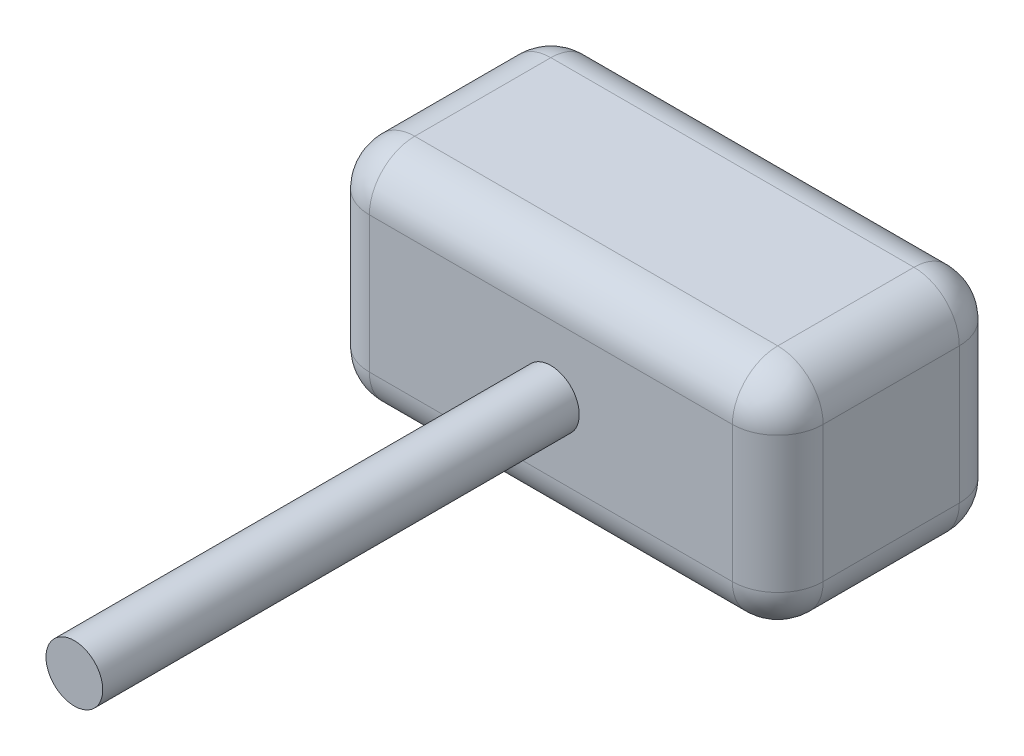
ISO-10303-21;
HEADER;
FILE_DESCRIPTION(('STEP AP214'),'2;1');
FILE_NAME('part.step','',(''),(''),'','','');
FILE_SCHEMA(('AUTOMOTIVE_DESIGN { 1 0 10303 214 1 1 1 1 }'));
ENDSEC;
DATA;
#1=APPLICATION_CONTEXT('core data for automotive mechanical design processes');
#2=APPLICATION_PROTOCOL_DEFINITION('international standard','automotive_design',2000,#1);
#3=PRODUCT_CONTEXT('',#1,'mechanical');
#4=PRODUCT('Part','Part','',(#3));
#5=PRODUCT_RELATED_PRODUCT_CATEGORY('part','',(#4));
#6=PRODUCT_DEFINITION_FORMATION('','',#4);
#7=PRODUCT_DEFINITION_CONTEXT('part definition',#1,'design');
#8=PRODUCT_DEFINITION('design','',#6,#7);
#9=PRODUCT_DEFINITION_SHAPE('','',#8);
#10=(LENGTH_UNIT() NAMED_UNIT(*) SI_UNIT(.MILLI.,.METRE.));
#11=(NAMED_UNIT(*) PLANE_ANGLE_UNIT() SI_UNIT($,.RADIAN.));
#12=(NAMED_UNIT(*) SI_UNIT($,.STERADIAN.) SOLID_ANGLE_UNIT());
#13=UNCERTAINTY_MEASURE_WITH_UNIT(LENGTH_MEASURE(1.E-05),#10,'distance_accuracy_value','');
#14=(GEOMETRIC_REPRESENTATION_CONTEXT(3) GLOBAL_UNCERTAINTY_ASSIGNED_CONTEXT((#13)) GLOBAL_UNIT_ASSIGNED_CONTEXT((#10,
#11,#12)) REPRESENTATION_CONTEXT('',''));
#15=CARTESIAN_POINT('',(0.,0.,0.));
#16=DIRECTION('',(0.,0.,1.));
#17=DIRECTION('',(1.,0.,0.));
#18=AXIS2_PLACEMENT_3D('',#15,#16,#17);
#19=CARTESIAN_POINT('',(-10.,-5.,5.));
#20=DIRECTION('',(1.,0.,0.));
#21=DIRECTION('',(0.,1.,0.));
#22=AXIS2_PLACEMENT_3D('',#19,#20,#21);
#23=PLANE('',#22);
#24=DIRECTION('',(0.,0.,-1.));
#25=VECTOR('',#24,1.);
#26=CARTESIAN_POINT('',(-10.,-3.,5.));
#27=LINE('',#26,#25);
#28=CARTESIAN_POINT('',(-10.,-3.,-3.));
#29=VERTEX_POINT('',#28);
#30=CARTESIAN_POINT('',(-10.,-3.,3.));
#31=VERTEX_POINT('',#30);
#32=EDGE_CURVE('E277',#29,#31,#27,.F.);
#33=ORIENTED_EDGE('',*,*,#32,.T.);
#34=DIRECTION('',(0.,-1.,0.));
#35=VECTOR('',#34,1.);
#36=CARTESIAN_POINT('',(-10.,-5.,3.));
#37=LINE('',#36,#35);
#38=CARTESIAN_POINT('',(-10.,3.,3.));
#39=VERTEX_POINT('',#38);
#40=EDGE_CURVE('E280',#31,#39,#37,.F.);
#41=ORIENTED_EDGE('',*,*,#40,.T.);
#42=DIRECTION('',(0.,0.,-1.));
#43=VECTOR('',#42,1.);
#44=CARTESIAN_POINT('',(-10.,3.,5.));
#45=LINE('',#44,#43);
#46=CARTESIAN_POINT('',(-10.,3.,-3.));
#47=VERTEX_POINT('',#46);
#48=EDGE_CURVE('E271',#39,#47,#45,.T.);
#49=ORIENTED_EDGE('',*,*,#48,.T.);
#50=DIRECTION('',(0.,-1.,0.));
#51=VECTOR('',#50,1.);
#52=CARTESIAN_POINT('',(-10.,-5.,-3.));
#53=LINE('',#52,#51);
#54=EDGE_CURVE('E274',#47,#29,#53,.T.);
#55=ORIENTED_EDGE('',*,*,#54,.T.);
#56=EDGE_LOOP('',(#33,#41,#49,#55));
#57=FACE_BOUND('',#56,.T.);
#58=ADVANCED_FACE('F41',(#57),#23,.F.);
#59=CARTESIAN_POINT('',(10.,-5.,5.));
#60=DIRECTION('',(0.,1.,0.));
#61=DIRECTION('',(0.,0.,1.));
#62=AXIS2_PLACEMENT_3D('',#59,#60,#61);
#63=PLANE('',#62);
#64=DIRECTION('',(1.,0.,0.));
#65=VECTOR('',#64,1.);
#66=CARTESIAN_POINT('',(10.,-5.,3.));
#67=LINE('',#66,#65);
#68=CARTESIAN_POINT('',(8.,-5.,3.));
#69=VERTEX_POINT('',#68);
#70=CARTESIAN_POINT('',(-8.,-5.,3.));
#71=VERTEX_POINT('',#70);
#72=EDGE_CURVE('E251',#69,#71,#67,.F.);
#73=ORIENTED_EDGE('',*,*,#72,.T.);
#74=DIRECTION('',(0.,0.,-1.));
#75=VECTOR('',#74,1.);
#76=CARTESIAN_POINT('',(-8.,-5.,5.));
#77=LINE('',#76,#75);
#78=CARTESIAN_POINT('',(-8.,-5.,-3.));
#79=VERTEX_POINT('',#78);
#80=EDGE_CURVE('E255',#71,#79,#77,.T.);
#81=ORIENTED_EDGE('',*,*,#80,.T.);
#82=DIRECTION('',(1.,0.,0.));
#83=VECTOR('',#82,1.);
#84=CARTESIAN_POINT('',(10.,-5.,-3.));
#85=LINE('',#84,#83);
#86=CARTESIAN_POINT('',(8.,-5.,-3.));
#87=VERTEX_POINT('',#86);
#88=EDGE_CURVE('E248',#79,#87,#85,.T.);
#89=ORIENTED_EDGE('',*,*,#88,.T.);
#90=DIRECTION('',(0.,0.,-1.));
#91=VECTOR('',#90,1.);
#92=CARTESIAN_POINT('',(8.,-5.,5.));
#93=LINE('',#92,#91);
#94=EDGE_CURVE('E245',#87,#69,#93,.F.);
#95=ORIENTED_EDGE('',*,*,#94,.T.);
#96=EDGE_LOOP('',(#73,#81,#89,#95));
#97=FACE_BOUND('',#96,.T.);
#98=ADVANCED_FACE('F335',(#97),#63,.F.);
#99=CARTESIAN_POINT('',(10.,5.,5.));
#100=DIRECTION('',(-1.,0.,0.));
#101=DIRECTION('',(0.,-1.,0.));
#102=AXIS2_PLACEMENT_3D('',#99,#100,#101);
#103=PLANE('',#102);
#104=DIRECTION('',(0.,1.,0.));
#105=VECTOR('',#104,1.);
#106=CARTESIAN_POINT('',(10.,5.,3.));
#107=LINE('',#106,#105);
#108=CARTESIAN_POINT('',(10.,3.,3.));
#109=VERTEX_POINT('',#108);
#110=CARTESIAN_POINT('',(10.,-3.,3.));
#111=VERTEX_POINT('',#110);
#112=EDGE_CURVE('E166',#109,#111,#107,.F.);
#113=ORIENTED_EDGE('',*,*,#112,.T.);
#114=DIRECTION('',(0.,0.,-1.));
#115=VECTOR('',#114,1.);
#116=CARTESIAN_POINT('',(10.,-3.,5.));
#117=LINE('',#116,#115);
#118=CARTESIAN_POINT('',(10.,-3.,-3.));
#119=VERTEX_POINT('',#118);
#120=EDGE_CURVE('E292',#111,#119,#117,.T.);
#121=ORIENTED_EDGE('',*,*,#120,.T.);
#122=DIRECTION('',(0.,1.,0.));
#123=VECTOR('',#122,1.);
#124=CARTESIAN_POINT('',(10.,5.,-3.));
#125=LINE('',#124,#123);
#126=CARTESIAN_POINT('',(10.,3.,-3.));
#127=VERTEX_POINT('',#126);
#128=EDGE_CURVE('E287',#119,#127,#125,.T.);
#129=ORIENTED_EDGE('',*,*,#128,.T.);
#130=DIRECTION('',(0.,0.,-1.));
#131=VECTOR('',#130,1.);
#132=CARTESIAN_POINT('',(10.,3.,5.));
#133=LINE('',#132,#131);
#134=EDGE_CURVE('E284',#127,#109,#133,.F.);
#135=ORIENTED_EDGE('',*,*,#134,.T.);
#136=EDGE_LOOP('',(#113,#121,#129,#135));
#137=FACE_BOUND('',#136,.T.);
#138=ADVANCED_FACE('F348',(#137),#103,.F.);
#139=CARTESIAN_POINT('',(-10.,5.,5.));
#140=DIRECTION('',(0.,-1.,0.));
#141=DIRECTION('',(0.,0.,-1.));
#142=AXIS2_PLACEMENT_3D('',#139,#140,#141);
#143=PLANE('',#142);
#144=DIRECTION('',(-1.,0.,0.));
#145=VECTOR('',#144,1.);
#146=CARTESIAN_POINT('',(-10.,5.,3.));
#147=LINE('',#146,#145);
#148=CARTESIAN_POINT('',(-8.,5.,3.));
#149=VERTEX_POINT('',#148);
#150=CARTESIAN_POINT('',(8.,5.,3.));
#151=VERTEX_POINT('',#150);
#152=EDGE_CURVE('E51',#149,#151,#147,.F.);
#153=ORIENTED_EDGE('',*,*,#152,.T.);
#154=DIRECTION('',(0.,0.,-1.));
#155=VECTOR('',#154,1.);
#156=CARTESIAN_POINT('',(8.,5.,5.));
#157=LINE('',#156,#155);
#158=CARTESIAN_POINT('',(8.,5.,-3.));
#159=VERTEX_POINT('',#158);
#160=EDGE_CURVE('E11',#151,#159,#157,.T.);
#161=ORIENTED_EDGE('',*,*,#160,.T.);
#162=DIRECTION('',(-1.,0.,0.));
#163=VECTOR('',#162,1.);
#164=CARTESIAN_POINT('',(-10.,5.,-3.));
#165=LINE('',#164,#163);
#166=CARTESIAN_POINT('',(-8.,5.,-3.));
#167=VERTEX_POINT('',#166);
#168=EDGE_CURVE('E296',#159,#167,#165,.T.);
#169=ORIENTED_EDGE('',*,*,#168,.T.);
#170=DIRECTION('',(0.,0.,-1.));
#171=VECTOR('',#170,1.);
#172=CARTESIAN_POINT('',(-8.,5.,5.));
#173=LINE('',#172,#171);
#174=EDGE_CURVE('E62',#167,#149,#173,.F.);
#175=ORIENTED_EDGE('',*,*,#174,.T.);
#176=EDGE_LOOP('',(#153,#161,#169,#175));
#177=FACE_BOUND('',#176,.T.);
#178=ADVANCED_FACE('F353',(#177),#143,.F.);
#179=CARTESIAN_POINT('',(0.,0.,5.));
#180=DIRECTION('',(0.,0.,-1.));
#181=DIRECTION('',(-1.,0.,0.));
#182=AXIS2_PLACEMENT_3D('',#179,#180,#181);
#183=PLANE('',#182);
#184=DIRECTION('',(0.,-1.,0.));
#185=VECTOR('',#184,1.);
#186=CARTESIAN_POINT('',(-8.,0.,5.));
#187=LINE('',#186,#185);
#188=CARTESIAN_POINT('',(-8.,3.,5.));
#189=VERTEX_POINT('',#188);
#190=CARTESIAN_POINT('',(-8.,-3.,5.));
#191=VERTEX_POINT('',#190);
#192=EDGE_CURVE('E142',#189,#191,#187,.T.);
#193=ORIENTED_EDGE('',*,*,#192,.T.);
#194=DIRECTION('',(1.,0.,0.));
#195=VECTOR('',#194,1.);
#196=CARTESIAN_POINT('',(0.,-3.,5.));
#197=LINE('',#196,#195);
#198=CARTESIAN_POINT('',(8.,-3.,5.));
#199=VERTEX_POINT('',#198);
#200=EDGE_CURVE('E137',#191,#199,#197,.T.);
#201=ORIENTED_EDGE('',*,*,#200,.T.);
#202=DIRECTION('',(0.,1.,0.));
#203=VECTOR('',#202,1.);
#204=CARTESIAN_POINT('',(8.,0.,5.));
#205=LINE('',#204,#203);
#206=CARTESIAN_POINT('',(8.,3.,5.));
#207=VERTEX_POINT('',#206);
#208=EDGE_CURVE('E130',#199,#207,#205,.T.);
#209=ORIENTED_EDGE('',*,*,#208,.T.);
#210=DIRECTION('',(-1.,0.,0.));
#211=VECTOR('',#210,1.);
#212=CARTESIAN_POINT('',(0.,3.,5.));
#213=LINE('',#212,#211);
#214=EDGE_CURVE('E134',#207,#189,#213,.T.);
#215=ORIENTED_EDGE('',*,*,#214,.T.);
#216=EDGE_LOOP('',(#193,#201,#209,#215));
#217=FACE_BOUND('',#216,.T.);
#218=CARTESIAN_POINT('',(0.,0.,5.));
#219=DIRECTION('',(0.,0.,1.));
#220=DIRECTION('',(1.,0.,0.));
#221=AXIS2_PLACEMENT_3D('',#218,#219,#220);
#222=CIRCLE('',#221,1.25);
#223=CARTESIAN_POINT('',(1.25,0.,5.));
#224=VERTEX_POINT('',#223);
#225=EDGE_CURVE('E154',#224,#224,#222,.T.);
#226=ORIENTED_EDGE('',*,*,#225,.F.);
#227=EDGE_LOOP('',(#226));
#228=FACE_BOUND('',#227,.T.);
#229=ADVANCED_FACE('F132',(#217,#228),#183,.F.);
#230=CARTESIAN_POINT('',(0.,0.,-5.));
#231=DIRECTION('',(0.,0.,-1.));
#232=DIRECTION('',(-1.,0.,0.));
#233=AXIS2_PLACEMENT_3D('',#230,#231,#232);
#234=PLANE('',#233);
#235=DIRECTION('',(0.,1.,0.));
#236=VECTOR('',#235,1.);
#237=CARTESIAN_POINT('',(8.,-5.,-5.));
#238=LINE('',#237,#236);
#239=CARTESIAN_POINT('',(8.,3.,-5.));
#240=VERTEX_POINT('',#239);
#241=CARTESIAN_POINT('',(8.,-3.,-5.));
#242=VERTEX_POINT('',#241);
#243=EDGE_CURVE('E261',#240,#242,#238,.F.);
#244=ORIENTED_EDGE('',*,*,#243,.T.);
#245=DIRECTION('',(1.,0.,0.));
#246=VECTOR('',#245,1.);
#247=CARTESIAN_POINT('',(-10.,-3.,-5.));
#248=LINE('',#247,#246);
#249=CARTESIAN_POINT('',(-8.,-3.,-5.));
#250=VERTEX_POINT('',#249);
#251=EDGE_CURVE('E267',#242,#250,#248,.F.);
#252=ORIENTED_EDGE('',*,*,#251,.T.);
#253=DIRECTION('',(0.,-1.,0.));
#254=VECTOR('',#253,1.);
#255=CARTESIAN_POINT('',(-8.,5.,-5.));
#256=LINE('',#255,#254);
#257=CARTESIAN_POINT('',(-8.,3.,-5.));
#258=VERTEX_POINT('',#257);
#259=EDGE_CURVE('E264',#250,#258,#256,.F.);
#260=ORIENTED_EDGE('',*,*,#259,.T.);
#261=DIRECTION('',(-1.,0.,0.));
#262=VECTOR('',#261,1.);
#263=CARTESIAN_POINT('',(10.,3.,-5.));
#264=LINE('',#263,#262);
#265=EDGE_CURVE('E258',#258,#240,#264,.F.);
#266=ORIENTED_EDGE('',*,*,#265,.T.);
#267=EDGE_LOOP('',(#244,#252,#260,#266));
#268=FACE_BOUND('',#267,.T.);
#269=ADVANCED_FACE('F521',(#268),#234,.T.);
#270=CARTESIAN_POINT('',(-10.,3.,-3.));
#271=DIRECTION('',(1.,0.,0.));
#272=DIRECTION('',(0.,0.,-1.));
#273=AXIS2_PLACEMENT_3D('',#270,#271,#272);
#274=CYLINDRICAL_SURFACE('',#273,2.);
#275=CARTESIAN_POINT('',(-8.,3.,-3.));
#276=DIRECTION('',(-1.,0.,0.));
#277=DIRECTION('',(0.,0.,1.));
#278=AXIS2_PLACEMENT_3D('',#275,#276,#277);
#279=CIRCLE('',#278,2.);
#280=EDGE_CURVE('E45',#167,#258,#279,.T.);
#281=ORIENTED_EDGE('',*,*,#280,.F.);
#282=ORIENTED_EDGE('',*,*,#168,.F.);
#283=CARTESIAN_POINT('',(8.,3.,-3.));
#284=DIRECTION('',(1.,0.,0.));
#285=DIRECTION('',(0.,1.,0.));
#286=AXIS2_PLACEMENT_3D('',#283,#284,#285);
#287=CIRCLE('',#286,2.);
#288=EDGE_CURVE('E219',#240,#159,#287,.T.);
#289=ORIENTED_EDGE('',*,*,#288,.F.);
#290=ORIENTED_EDGE('',*,*,#265,.F.);
#291=EDGE_LOOP('',(#281,#282,#289,#290));
#292=FACE_BOUND('',#291,.T.);
#293=ADVANCED_FACE('F43',(#292),#274,.T.);
#294=CARTESIAN_POINT('',(-8.,3.,-3.));
#295=DIRECTION('',(0.,0.,1.));
#296=DIRECTION('',(1.,0.,0.));
#297=AXIS2_PLACEMENT_3D('',#294,#295,#296);
#298=SPHERICAL_SURFACE('',#297,2.);
#299=CARTESIAN_POINT('',(-8.,3.,-3.));
#300=DIRECTION('',(0.,0.,-1.));
#301=DIRECTION('',(-1.,0.,0.));
#302=AXIS2_PLACEMENT_3D('',#299,#300,#301);
#303=CIRCLE('',#302,2.);
#304=EDGE_CURVE('E212',#167,#47,#303,.F.);
#305=ORIENTED_EDGE('',*,*,#304,.F.);
#306=ORIENTED_EDGE('',*,*,#280,.T.);
#307=CARTESIAN_POINT('',(-8.,3.,-3.));
#308=DIRECTION('',(0.,1.,0.));
#309=DIRECTION('',(-1.,0.,0.));
#310=AXIS2_PLACEMENT_3D('',#307,#308,#309);
#311=CIRCLE('',#310,2.);
#312=EDGE_CURVE('E216',#47,#258,#311,.F.);
#313=ORIENTED_EDGE('',*,*,#312,.F.);
#314=EDGE_LOOP('',(#305,#306,#313));
#315=FACE_BOUND('',#314,.T.);
#316=ADVANCED_FACE('F356',(#315),#298,.T.);
#317=CARTESIAN_POINT('',(8.,3.,-3.));
#318=DIRECTION('',(0.,0.,1.));
#319=DIRECTION('',(1.,0.,0.));
#320=AXIS2_PLACEMENT_3D('',#317,#318,#319);
#321=SPHERICAL_SURFACE('',#320,2.);
#322=CARTESIAN_POINT('',(8.,3.,-3.));
#323=DIRECTION('',(0.,1.,0.));
#324=DIRECTION('',(-1.,0.,0.));
#325=AXIS2_PLACEMENT_3D('',#322,#323,#324);
#326=CIRCLE('',#325,2.);
#327=EDGE_CURVE('E205',#240,#127,#326,.F.);
#328=ORIENTED_EDGE('',*,*,#327,.F.);
#329=ORIENTED_EDGE('',*,*,#288,.T.);
#330=CARTESIAN_POINT('',(8.,3.,-3.));
#331=DIRECTION('',(0.,0.,-1.));
#332=DIRECTION('',(-1.,0.,0.));
#333=AXIS2_PLACEMENT_3D('',#330,#331,#332);
#334=CIRCLE('',#333,2.);
#335=EDGE_CURVE('E209',#127,#159,#334,.F.);
#336=ORIENTED_EDGE('',*,*,#335,.F.);
#337=EDGE_LOOP('',(#328,#329,#336));
#338=FACE_BOUND('',#337,.T.);
#339=ADVANCED_FACE('F386',(#338),#321,.T.);
#340=CARTESIAN_POINT('',(-8.,-5.,-3.));
#341=DIRECTION('',(0.,1.,0.));
#342=DIRECTION('',(-1.,0.,0.));
#343=AXIS2_PLACEMENT_3D('',#340,#341,#342);
#344=CYLINDRICAL_SURFACE('',#343,2.);
#345=ORIENTED_EDGE('',*,*,#312,.T.);
#346=ORIENTED_EDGE('',*,*,#259,.F.);
#347=CARTESIAN_POINT('',(-8.,-3.,-3.));
#348=DIRECTION('',(0.,-1.,0.));
#349=DIRECTION('',(1.,0.,0.));
#350=AXIS2_PLACEMENT_3D('',#347,#348,#349);
#351=CIRCLE('',#350,2.);
#352=EDGE_CURVE('E198',#29,#250,#351,.T.);
#353=ORIENTED_EDGE('',*,*,#352,.F.);
#354=ORIENTED_EDGE('',*,*,#54,.F.);
#355=EDGE_LOOP('',(#345,#346,#353,#354));
#356=FACE_BOUND('',#355,.T.);
#357=ADVANCED_FACE('F372',(#356),#344,.T.);
#358=CARTESIAN_POINT('',(-8.,3.,5.));
#359=DIRECTION('',(0.,0.,-1.));
#360=DIRECTION('',(-1.,0.,0.));
#361=AXIS2_PLACEMENT_3D('',#358,#359,#360);
#362=CYLINDRICAL_SURFACE('',#361,2.);
#363=ORIENTED_EDGE('',*,*,#304,.T.);
#364=ORIENTED_EDGE('',*,*,#48,.F.);
#365=CARTESIAN_POINT('',(-8.,3.,3.));
#366=DIRECTION('',(0.,0.,1.));
#367=DIRECTION('',(1.,0.,0.));
#368=AXIS2_PLACEMENT_3D('',#365,#366,#367);
#369=CIRCLE('',#368,2.);
#370=EDGE_CURVE('E194',#149,#39,#369,.T.);
#371=ORIENTED_EDGE('',*,*,#370,.F.);
#372=ORIENTED_EDGE('',*,*,#174,.F.);
#373=EDGE_LOOP('',(#363,#364,#371,#372));
#374=FACE_BOUND('',#373,.T.);
#375=ADVANCED_FACE('F361',(#374),#362,.T.);
#376=CARTESIAN_POINT('',(0.,3.,3.));
#377=DIRECTION('',(-1.,0.,0.));
#378=DIRECTION('',(0.,0.,1.));
#379=AXIS2_PLACEMENT_3D('',#376,#377,#378);
#380=CYLINDRICAL_SURFACE('',#379,2.);
#381=CARTESIAN_POINT('',(8.,3.,3.));
#382=DIRECTION('',(1.,0.,0.));
#383=DIRECTION('',(0.,0.,-1.));
#384=AXIS2_PLACEMENT_3D('',#381,#382,#383);
#385=CIRCLE('',#384,2.);
#386=EDGE_CURVE('E148',#151,#207,#385,.T.);
#387=ORIENTED_EDGE('',*,*,#386,.F.);
#388=ORIENTED_EDGE('',*,*,#152,.F.);
#389=CARTESIAN_POINT('',(-8.,3.,3.));
#390=DIRECTION('',(-1.,0.,0.));
#391=DIRECTION('',(0.,0.,1.));
#392=AXIS2_PLACEMENT_3D('',#389,#390,#391);
#393=CIRCLE('',#392,2.);
#394=EDGE_CURVE('E151',#189,#149,#393,.T.);
#395=ORIENTED_EDGE('',*,*,#394,.F.);
#396=ORIENTED_EDGE('',*,*,#214,.F.);
#397=EDGE_LOOP('',(#387,#388,#395,#396));
#398=FACE_BOUND('',#397,.T.);
#399=ADVANCED_FACE('F147',(#398),#380,.T.);
#400=CARTESIAN_POINT('',(8.,3.,5.));
#401=DIRECTION('',(0.,0.,-1.));
#402=DIRECTION('',(-1.,0.,0.));
#403=AXIS2_PLACEMENT_3D('',#400,#401,#402);
#404=CYLINDRICAL_SURFACE('',#403,2.);
#405=ORIENTED_EDGE('',*,*,#335,.T.);
#406=ORIENTED_EDGE('',*,*,#160,.F.);
#407=CARTESIAN_POINT('',(8.,3.,3.));
#408=DIRECTION('',(0.,0.,1.));
#409=DIRECTION('',(1.,0.,0.));
#410=AXIS2_PLACEMENT_3D('',#407,#408,#409);
#411=CIRCLE('',#410,2.);
#412=EDGE_CURVE('E162',#109,#151,#411,.T.);
#413=ORIENTED_EDGE('',*,*,#412,.F.);
#414=ORIENTED_EDGE('',*,*,#134,.F.);
#415=EDGE_LOOP('',(#405,#406,#413,#414));
#416=FACE_BOUND('',#415,.T.);
#417=ADVANCED_FACE('F352',(#416),#404,.T.);
#418=CARTESIAN_POINT('',(8.,5.,-3.));
#419=DIRECTION('',(0.,-1.,0.));
#420=DIRECTION('',(1.,0.,0.));
#421=AXIS2_PLACEMENT_3D('',#418,#419,#420);
#422=CYLINDRICAL_SURFACE('',#421,2.);
#423=ORIENTED_EDGE('',*,*,#327,.T.);
#424=ORIENTED_EDGE('',*,*,#128,.F.);
#425=CARTESIAN_POINT('',(8.,-3.,-3.));
#426=DIRECTION('',(0.,-1.,0.));
#427=DIRECTION('',(1.,0.,0.));
#428=AXIS2_PLACEMENT_3D('',#425,#426,#427);
#429=CIRCLE('',#428,2.);
#430=EDGE_CURVE('E186',#242,#119,#429,.T.);
#431=ORIENTED_EDGE('',*,*,#430,.F.);
#432=ORIENTED_EDGE('',*,*,#243,.F.);
#433=EDGE_LOOP('',(#423,#424,#431,#432));
#434=FACE_BOUND('',#433,.T.);
#435=ADVANCED_FACE('F385',(#434),#422,.T.);
#436=CARTESIAN_POINT('',(10.,-3.,-3.));
#437=DIRECTION('',(-1.,0.,0.));
#438=DIRECTION('',(0.,0.,1.));
#439=AXIS2_PLACEMENT_3D('',#436,#437,#438);
#440=CYLINDRICAL_SURFACE('',#439,2.);
#441=CARTESIAN_POINT('',(-8.,-3.,-3.));
#442=DIRECTION('',(-1.,0.,0.));
#443=DIRECTION('',(0.,-1.,0.));
#444=AXIS2_PLACEMENT_3D('',#441,#442,#443);
#445=CIRCLE('',#444,2.);
#446=EDGE_CURVE('E201',#250,#79,#445,.T.);
#447=ORIENTED_EDGE('',*,*,#446,.F.);
#448=ORIENTED_EDGE('',*,*,#251,.F.);
#449=CARTESIAN_POINT('',(8.,-3.,-3.));
#450=DIRECTION('',(1.,0.,0.));
#451=DIRECTION('',(0.,0.,-1.));
#452=AXIS2_PLACEMENT_3D('',#449,#450,#451);
#453=CIRCLE('',#452,2.);
#454=EDGE_CURVE('E182',#87,#242,#453,.T.);
#455=ORIENTED_EDGE('',*,*,#454,.F.);
#456=ORIENTED_EDGE('',*,*,#88,.F.);
#457=EDGE_LOOP('',(#447,#448,#455,#456));
#458=FACE_BOUND('',#457,.T.);
#459=ADVANCED_FACE('F378',(#458),#440,.T.);
#460=CARTESIAN_POINT('',(-8.,-3.,-3.));
#461=DIRECTION('',(0.,0.,1.));
#462=DIRECTION('',(1.,0.,0.));
#463=AXIS2_PLACEMENT_3D('',#460,#461,#462);
#464=SPHERICAL_SURFACE('',#463,2.);
#465=ORIENTED_EDGE('',*,*,#352,.T.);
#466=ORIENTED_EDGE('',*,*,#446,.T.);
#467=CARTESIAN_POINT('',(-8.,-3.,-3.));
#468=DIRECTION('',(0.,0.,-1.));
#469=DIRECTION('',(-1.,0.,0.));
#470=AXIS2_PLACEMENT_3D('',#467,#468,#469);
#471=CIRCLE('',#470,2.);
#472=EDGE_CURVE('E173',#29,#79,#471,.F.);
#473=ORIENTED_EDGE('',*,*,#472,.F.);
#474=EDGE_LOOP('',(#465,#466,#473));
#475=FACE_BOUND('',#474,.T.);
#476=ADVANCED_FACE('F375',(#475),#464,.T.);
#477=CARTESIAN_POINT('',(-8.,3.,3.));
#478=DIRECTION('',(0.,0.,1.));
#479=DIRECTION('',(1.,0.,0.));
#480=AXIS2_PLACEMENT_3D('',#477,#478,#479);
#481=SPHERICAL_SURFACE('',#480,2.);
#482=ORIENTED_EDGE('',*,*,#394,.T.);
#483=ORIENTED_EDGE('',*,*,#370,.T.);
#484=CARTESIAN_POINT('',(-8.,3.,3.));
#485=DIRECTION('',(0.,1.,0.));
#486=DIRECTION('',(-1.,0.,0.));
#487=AXIS2_PLACEMENT_3D('',#484,#485,#486);
#488=CIRCLE('',#487,2.);
#489=EDGE_CURVE('E168',#189,#39,#488,.F.);
#490=ORIENTED_EDGE('',*,*,#489,.F.);
#491=EDGE_LOOP('',(#482,#483,#490));
#492=FACE_BOUND('',#491,.T.);
#493=ADVANCED_FACE('F363',(#492),#481,.T.);
#494=CARTESIAN_POINT('',(8.,3.,3.));
#495=DIRECTION('',(0.,0.,1.));
#496=DIRECTION('',(1.,0.,0.));
#497=AXIS2_PLACEMENT_3D('',#494,#495,#496);
#498=SPHERICAL_SURFACE('',#497,2.);
#499=ORIENTED_EDGE('',*,*,#412,.T.);
#500=ORIENTED_EDGE('',*,*,#386,.T.);
#501=CARTESIAN_POINT('',(8.,3.,3.));
#502=DIRECTION('',(0.,1.,0.));
#503=DIRECTION('',(-1.,0.,0.));
#504=AXIS2_PLACEMENT_3D('',#501,#502,#503);
#505=CIRCLE('',#504,2.);
#506=EDGE_CURVE('E159',#109,#207,#505,.F.);
#507=ORIENTED_EDGE('',*,*,#506,.F.);
#508=EDGE_LOOP('',(#499,#500,#507));
#509=FACE_BOUND('',#508,.T.);
#510=ADVANCED_FACE('F158',(#509),#498,.T.);
#511=CARTESIAN_POINT('',(8.,-3.,-3.));
#512=DIRECTION('',(0.,0.,1.));
#513=DIRECTION('',(1.,0.,0.));
#514=AXIS2_PLACEMENT_3D('',#511,#512,#513);
#515=SPHERICAL_SURFACE('',#514,2.);
#516=ORIENTED_EDGE('',*,*,#454,.T.);
#517=ORIENTED_EDGE('',*,*,#430,.T.);
#518=CARTESIAN_POINT('',(8.,-3.,-3.));
#519=DIRECTION('',(0.,0.,-1.));
#520=DIRECTION('',(-1.,0.,0.));
#521=AXIS2_PLACEMENT_3D('',#518,#519,#520);
#522=CIRCLE('',#521,2.);
#523=EDGE_CURVE('E169',#87,#119,#522,.F.);
#524=ORIENTED_EDGE('',*,*,#523,.F.);
#525=EDGE_LOOP('',(#516,#517,#524));
#526=FACE_BOUND('',#525,.T.);
#527=ADVANCED_FACE('F382',(#526),#515,.T.);
#528=CARTESIAN_POINT('',(-8.,-3.,5.));
#529=DIRECTION('',(0.,0.,-1.));
#530=DIRECTION('',(-1.,0.,0.));
#531=AXIS2_PLACEMENT_3D('',#528,#529,#530);
#532=CYLINDRICAL_SURFACE('',#531,2.);
#533=ORIENTED_EDGE('',*,*,#472,.T.);
#534=ORIENTED_EDGE('',*,*,#80,.F.);
#535=CARTESIAN_POINT('',(-8.,-3.,3.));
#536=DIRECTION('',(0.,0.,1.));
#537=DIRECTION('',(1.,0.,0.));
#538=AXIS2_PLACEMENT_3D('',#535,#536,#537);
#539=CIRCLE('',#538,2.);
#540=EDGE_CURVE('E175',#31,#71,#539,.T.);
#541=ORIENTED_EDGE('',*,*,#540,.F.);
#542=ORIENTED_EDGE('',*,*,#32,.F.);
#543=EDGE_LOOP('',(#533,#534,#541,#542));
#544=FACE_BOUND('',#543,.T.);
#545=ADVANCED_FACE('F330',(#544),#532,.T.);
#546=CARTESIAN_POINT('',(-8.,0.,3.));
#547=DIRECTION('',(0.,-1.,0.));
#548=DIRECTION('',(1.,0.,0.));
#549=AXIS2_PLACEMENT_3D('',#546,#547,#548);
#550=CYLINDRICAL_SURFACE('',#549,2.);
#551=ORIENTED_EDGE('',*,*,#489,.T.);
#552=ORIENTED_EDGE('',*,*,#40,.F.);
#553=CARTESIAN_POINT('',(-8.,-3.,3.));
#554=DIRECTION('',(0.,-1.,0.));
#555=DIRECTION('',(1.,0.,0.));
#556=AXIS2_PLACEMENT_3D('',#553,#554,#555);
#557=CIRCLE('',#556,2.);
#558=EDGE_CURVE('E317',#191,#31,#557,.T.);
#559=ORIENTED_EDGE('',*,*,#558,.F.);
#560=ORIENTED_EDGE('',*,*,#192,.F.);
#561=EDGE_LOOP('',(#551,#552,#559,#560));
#562=FACE_BOUND('',#561,.T.);
#563=ADVANCED_FACE('F367',(#562),#550,.T.);
#564=CARTESIAN_POINT('',(8.,0.,3.));
#565=DIRECTION('',(0.,1.,0.));
#566=DIRECTION('',(-1.,0.,0.));
#567=AXIS2_PLACEMENT_3D('',#564,#565,#566);
#568=CYLINDRICAL_SURFACE('',#567,2.);
#569=ORIENTED_EDGE('',*,*,#506,.T.);
#570=ORIENTED_EDGE('',*,*,#208,.F.);
#571=CARTESIAN_POINT('',(8.,-3.,3.));
#572=DIRECTION('',(0.,-1.,0.));
#573=DIRECTION('',(1.,0.,0.));
#574=AXIS2_PLACEMENT_3D('',#571,#572,#573);
#575=CIRCLE('',#574,2.);
#576=EDGE_CURVE('E313',#111,#199,#575,.T.);
#577=ORIENTED_EDGE('',*,*,#576,.F.);
#578=ORIENTED_EDGE('',*,*,#112,.F.);
#579=EDGE_LOOP('',(#569,#570,#577,#578));
#580=FACE_BOUND('',#579,.T.);
#581=ADVANCED_FACE('F165',(#580),#568,.T.);
#582=CARTESIAN_POINT('',(8.,-3.,5.));
#583=DIRECTION('',(0.,0.,-1.));
#584=DIRECTION('',(-1.,0.,0.));
#585=AXIS2_PLACEMENT_3D('',#582,#583,#584);
#586=CYLINDRICAL_SURFACE('',#585,2.);
#587=ORIENTED_EDGE('',*,*,#523,.T.);
#588=ORIENTED_EDGE('',*,*,#120,.F.);
#589=CARTESIAN_POINT('',(8.,-3.,3.));
#590=DIRECTION('',(0.,0.,1.));
#591=DIRECTION('',(1.,0.,0.));
#592=AXIS2_PLACEMENT_3D('',#589,#590,#591);
#593=CIRCLE('',#592,2.);
#594=EDGE_CURVE('E309',#69,#111,#593,.T.);
#595=ORIENTED_EDGE('',*,*,#594,.F.);
#596=ORIENTED_EDGE('',*,*,#94,.F.);
#597=EDGE_LOOP('',(#587,#588,#595,#596));
#598=FACE_BOUND('',#597,.T.);
#599=ADVANCED_FACE('F345',(#598),#586,.T.);
#600=CARTESIAN_POINT('',(-8.,-3.,3.));
#601=DIRECTION('',(0.,0.,1.));
#602=DIRECTION('',(1.,0.,0.));
#603=AXIS2_PLACEMENT_3D('',#600,#601,#602);
#604=SPHERICAL_SURFACE('',#603,2.);
#605=ORIENTED_EDGE('',*,*,#558,.T.);
#606=ORIENTED_EDGE('',*,*,#540,.T.);
#607=CARTESIAN_POINT('',(-8.,-3.,3.));
#608=DIRECTION('',(-1.,0.,0.));
#609=DIRECTION('',(0.,0.,1.));
#610=AXIS2_PLACEMENT_3D('',#607,#608,#609);
#611=CIRCLE('',#610,2.);
#612=EDGE_CURVE('E306',#191,#71,#611,.F.);
#613=ORIENTED_EDGE('',*,*,#612,.F.);
#614=EDGE_LOOP('',(#605,#606,#613));
#615=FACE_BOUND('',#614,.T.);
#616=ADVANCED_FACE('F326',(#615),#604,.T.);
#617=CARTESIAN_POINT('',(8.,-3.,3.));
#618=DIRECTION('',(0.,0.,1.));
#619=DIRECTION('',(1.,0.,0.));
#620=AXIS2_PLACEMENT_3D('',#617,#618,#619);
#621=SPHERICAL_SURFACE('',#620,2.);
#622=ORIENTED_EDGE('',*,*,#594,.T.);
#623=ORIENTED_EDGE('',*,*,#576,.T.);
#624=CARTESIAN_POINT('',(8.,-3.,3.));
#625=DIRECTION('',(1.,0.,0.));
#626=DIRECTION('',(0.,0.,-1.));
#627=AXIS2_PLACEMENT_3D('',#624,#625,#626);
#628=CIRCLE('',#627,2.);
#629=EDGE_CURVE('E303',#69,#199,#628,.F.);
#630=ORIENTED_EDGE('',*,*,#629,.F.);
#631=EDGE_LOOP('',(#622,#623,#630));
#632=FACE_BOUND('',#631,.T.);
#633=ADVANCED_FACE('F342',(#632),#621,.T.);
#634=CARTESIAN_POINT('',(0.,-3.,3.));
#635=DIRECTION('',(1.,0.,0.));
#636=DIRECTION('',(0.,0.,-1.));
#637=AXIS2_PLACEMENT_3D('',#634,#635,#636);
#638=CYLINDRICAL_SURFACE('',#637,2.);
#639=ORIENTED_EDGE('',*,*,#612,.T.);
#640=ORIENTED_EDGE('',*,*,#72,.F.);
#641=ORIENTED_EDGE('',*,*,#629,.T.);
#642=ORIENTED_EDGE('',*,*,#200,.F.);
#643=EDGE_LOOP('',(#639,#640,#641,#642));
#644=FACE_BOUND('',#643,.T.);
#645=ADVANCED_FACE('F340',(#644),#638,.T.);
#646=CARTESIAN_POINT('',(0.,0.,-5.));
#647=DIRECTION('',(0.,0.,-1.));
#648=DIRECTION('',(-1.,0.,0.));
#649=AXIS2_PLACEMENT_3D('',#646,#647,#648);
#650=CYLINDRICAL_SURFACE('',#649,1.25);
#651=CARTESIAN_POINT('',(0.,0.,26.));
#652=DIRECTION('',(0.,0.,-1.));
#653=DIRECTION('',(-1.,0.,0.));
#654=AXIS2_PLACEMENT_3D('',#651,#652,#653);
#655=CIRCLE('',#654,1.25);
#656=CARTESIAN_POINT('',(-1.25,0.,26.));
#657=VERTEX_POINT('',#656);
#658=EDGE_CURVE('E239',#657,#657,#655,.T.);
#659=ORIENTED_EDGE('',*,*,#658,.T.);
#660=EDGE_LOOP('',(#659));
#661=FACE_BOUND('',#660,.T.);
#662=ORIENTED_EDGE('',*,*,#225,.T.);
#663=EDGE_LOOP('',(#662));
#664=FACE_BOUND('',#663,.T.);
#665=ADVANCED_FACE('F404',(#661,#664),#650,.T.);
#666=CARTESIAN_POINT('',(0.,0.,26.));
#667=DIRECTION('',(0.,0.,-1.));
#668=DIRECTION('',(-1.,0.,0.));
#669=AXIS2_PLACEMENT_3D('',#666,#667,#668);
#670=PLANE('',#669);
#671=ORIENTED_EDGE('',*,*,#658,.F.);
#672=EDGE_LOOP('',(#671));
#673=FACE_BOUND('',#672,.T.);
#674=ADVANCED_FACE('F505',(#673),#670,.F.);
#675=CLOSED_SHELL('',(#58,#98,#138,#178,#229,#269,#293,#316,#339,#357,#375,#399,#417,#435,#459,
#476,#493,#510,#527,#545,#563,#581,#599,#616,#633,#645,#665,#674));
#676=MANIFOLD_SOLID_BREP('B2',#675);
#677=ADVANCED_BREP_SHAPE_REPRESENTATION('',(#18,#676),#14);
#678=SHAPE_DEFINITION_REPRESENTATION(#9,#677);
ENDSEC;
END-ISO-10303-21;
